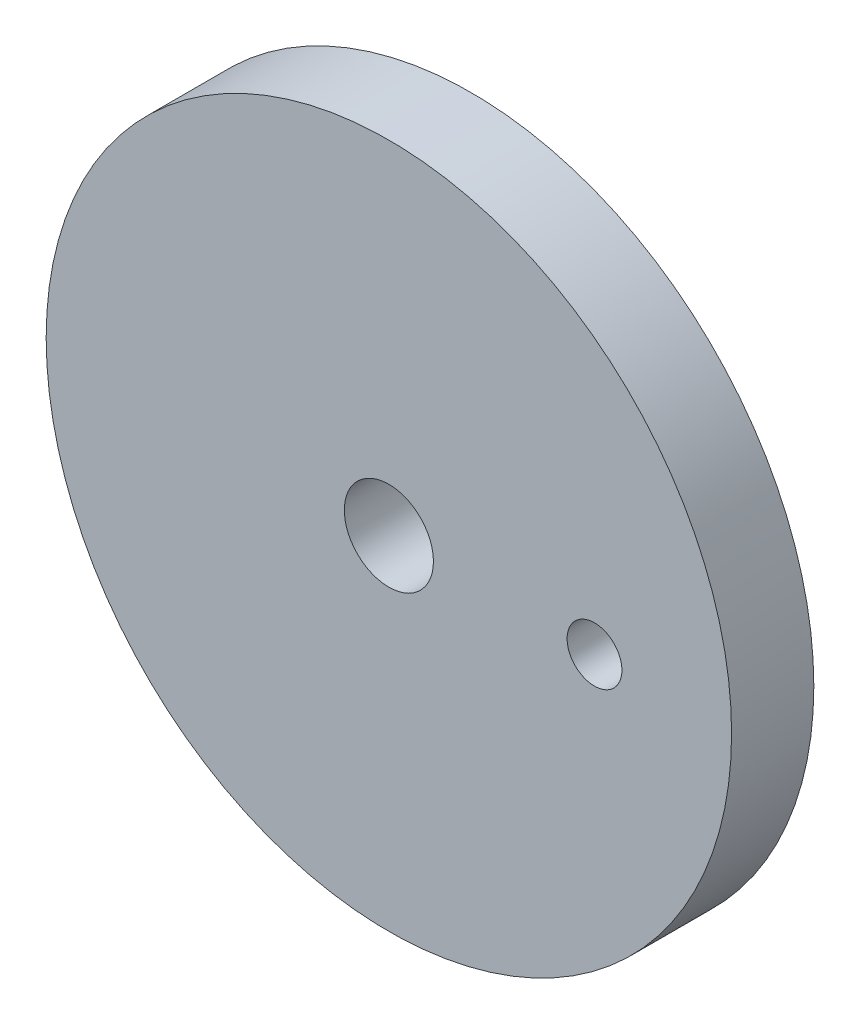
ISO-10303-21;
HEADER;
FILE_DESCRIPTION(('STEP AP214'),'2;1');
FILE_NAME('part.step','',(''),(''),'','','');
FILE_SCHEMA(('AUTOMOTIVE_DESIGN { 1 0 10303 214 1 1 1 1 }'));
ENDSEC;
DATA;
#1=APPLICATION_CONTEXT('core data for automotive mechanical design processes');
#2=APPLICATION_PROTOCOL_DEFINITION('international standard','automotive_design',2000,#1);
#3=PRODUCT_CONTEXT('',#1,'mechanical');
#4=PRODUCT('Part','Part','',(#3));
#5=PRODUCT_RELATED_PRODUCT_CATEGORY('part','',(#4));
#6=PRODUCT_DEFINITION_FORMATION('','',#4);
#7=PRODUCT_DEFINITION_CONTEXT('part definition',#1,'design');
#8=PRODUCT_DEFINITION('design','',#6,#7);
#9=PRODUCT_DEFINITION_SHAPE('','',#8);
#10=(LENGTH_UNIT() NAMED_UNIT(*) SI_UNIT(.MILLI.,.METRE.));
#11=(NAMED_UNIT(*) PLANE_ANGLE_UNIT() SI_UNIT($,.RADIAN.));
#12=(NAMED_UNIT(*) SI_UNIT($,.STERADIAN.) SOLID_ANGLE_UNIT());
#13=UNCERTAINTY_MEASURE_WITH_UNIT(LENGTH_MEASURE(1.E-05),#10,'distance_accuracy_value','');
#14=(GEOMETRIC_REPRESENTATION_CONTEXT(3) GLOBAL_UNCERTAINTY_ASSIGNED_CONTEXT((#13)) GLOBAL_UNIT_ASSIGNED_CONTEXT((#10,
#11,#12)) REPRESENTATION_CONTEXT('',''));
#15=CARTESIAN_POINT('',(0.,0.,0.));
#16=DIRECTION('',(0.,0.,1.));
#17=DIRECTION('',(1.,0.,0.));
#18=AXIS2_PLACEMENT_3D('',#15,#16,#17);
#19=CARTESIAN_POINT('',(0.,0.,3.));
#20=DIRECTION('',(0.,0.,1.));
#21=DIRECTION('',(1.,0.,0.));
#22=AXIS2_PLACEMENT_3D('',#19,#20,#21);
#23=PLANE('',#22);
#24=CARTESIAN_POINT('',(15.,0.,3.));
#25=DIRECTION('',(0.,0.,1.));
#26=DIRECTION('',(1.,0.,0.));
#27=AXIS2_PLACEMENT_3D('',#24,#25,#26);
#28=CIRCLE('',#27,2.);
#29=CARTESIAN_POINT('',(17.,0.,3.));
#30=VERTEX_POINT('',#29);
#31=EDGE_CURVE('E50',#30,#30,#28,.T.);
#32=ORIENTED_EDGE('',*,*,#31,.F.);
#33=EDGE_LOOP('',(#32));
#34=FACE_BOUND('',#33,.T.);
#35=CARTESIAN_POINT('',(0.,0.,3.));
#36=DIRECTION('',(0.,0.,1.));
#37=DIRECTION('',(1.,0.,0.));
#38=AXIS2_PLACEMENT_3D('',#35,#36,#37);
#39=CIRCLE('',#38,25.);
#40=CARTESIAN_POINT('',(25.,0.,3.));
#41=VERTEX_POINT('',#40);
#42=EDGE_CURVE('E10',#41,#41,#39,.T.);
#43=ORIENTED_EDGE('',*,*,#42,.T.);
#44=EDGE_LOOP('',(#43));
#45=FACE_BOUND('',#44,.T.);
#46=CARTESIAN_POINT('',(0.,0.,3.));
#47=DIRECTION('',(0.,0.,1.));
#48=DIRECTION('',(1.,0.,0.));
#49=AXIS2_PLACEMENT_3D('',#46,#47,#48);
#50=CIRCLE('',#49,3.25);
#51=CARTESIAN_POINT('',(3.25,0.,3.));
#52=VERTEX_POINT('',#51);
#53=EDGE_CURVE('E42',#52,#52,#50,.T.);
#54=ORIENTED_EDGE('',*,*,#53,.F.);
#55=EDGE_LOOP('',(#54));
#56=FACE_BOUND('',#55,.T.);
#57=ADVANCED_FACE('F31',(#34,#45,#56),#23,.T.);
#58=CARTESIAN_POINT('',(0.,0.,-3.));
#59=DIRECTION('',(0.,0.,1.));
#60=DIRECTION('',(1.,0.,0.));
#61=AXIS2_PLACEMENT_3D('',#58,#59,#60);
#62=PLANE('',#61);
#63=CARTESIAN_POINT('',(15.,0.,-3.));
#64=DIRECTION('',(0.,0.,1.));
#65=DIRECTION('',(1.,0.,0.));
#66=AXIS2_PLACEMENT_3D('',#63,#64,#65);
#67=CIRCLE('',#66,2.);
#68=CARTESIAN_POINT('',(17.,0.,-3.));
#69=VERTEX_POINT('',#68);
#70=EDGE_CURVE('E47',#69,#69,#67,.T.);
#71=ORIENTED_EDGE('',*,*,#70,.T.);
#72=EDGE_LOOP('',(#71));
#73=FACE_BOUND('',#72,.T.);
#74=CARTESIAN_POINT('',(0.,0.,-3.));
#75=DIRECTION('',(0.,0.,1.));
#76=DIRECTION('',(1.,0.,0.));
#77=AXIS2_PLACEMENT_3D('',#74,#75,#76);
#78=CIRCLE('',#77,25.);
#79=CARTESIAN_POINT('',(25.,0.,-3.));
#80=VERTEX_POINT('',#79);
#81=EDGE_CURVE('E35',#80,#80,#78,.T.);
#82=ORIENTED_EDGE('',*,*,#81,.F.);
#83=EDGE_LOOP('',(#82));
#84=FACE_BOUND('',#83,.T.);
#85=CARTESIAN_POINT('',(0.,0.,-3.));
#86=DIRECTION('',(0.,0.,1.));
#87=DIRECTION('',(1.,0.,0.));
#88=AXIS2_PLACEMENT_3D('',#85,#86,#87);
#89=CIRCLE('',#88,3.25);
#90=CARTESIAN_POINT('',(3.25,0.,-3.));
#91=VERTEX_POINT('',#90);
#92=EDGE_CURVE('E44',#91,#91,#89,.T.);
#93=ORIENTED_EDGE('',*,*,#92,.T.);
#94=EDGE_LOOP('',(#93));
#95=FACE_BOUND('',#94,.T.);
#96=ADVANCED_FACE('F56',(#73,#84,#95),#62,.F.);
#97=CARTESIAN_POINT('',(0.,0.,3.));
#98=DIRECTION('',(0.,0.,-1.));
#99=DIRECTION('',(-1.,0.,0.));
#100=AXIS2_PLACEMENT_3D('',#97,#98,#99);
#101=CYLINDRICAL_SURFACE('',#100,25.);
#102=ORIENTED_EDGE('',*,*,#42,.F.);
#103=EDGE_LOOP('',(#102));
#104=FACE_BOUND('',#103,.T.);
#105=ORIENTED_EDGE('',*,*,#81,.T.);
#106=EDGE_LOOP('',(#105));
#107=FACE_BOUND('',#106,.T.);
#108=ADVANCED_FACE('F33',(#104,#107),#101,.T.);
#109=CARTESIAN_POINT('',(0.,0.,3.));
#110=DIRECTION('',(0.,0.,-1.));
#111=DIRECTION('',(-1.,0.,0.));
#112=AXIS2_PLACEMENT_3D('',#109,#110,#111);
#113=CYLINDRICAL_SURFACE('',#112,3.25);
#114=ORIENTED_EDGE('',*,*,#53,.T.);
#115=EDGE_LOOP('',(#114));
#116=FACE_BOUND('',#115,.T.);
#117=ORIENTED_EDGE('',*,*,#92,.F.);
#118=EDGE_LOOP('',(#117));
#119=FACE_BOUND('',#118,.T.);
#120=ADVANCED_FACE('F62',(#116,#119),#113,.F.);
#121=CARTESIAN_POINT('',(15.,0.,-3.));
#122=DIRECTION('',(0.,0.,1.));
#123=DIRECTION('',(1.,0.,0.));
#124=AXIS2_PLACEMENT_3D('',#121,#122,#123);
#125=CYLINDRICAL_SURFACE('',#124,2.);
#126=ORIENTED_EDGE('',*,*,#70,.F.);
#127=EDGE_LOOP('',(#126));
#128=FACE_BOUND('',#127,.T.);
#129=ORIENTED_EDGE('',*,*,#31,.T.);
#130=EDGE_LOOP('',(#129));
#131=FACE_BOUND('',#130,.T.);
#132=ADVANCED_FACE('F59',(#128,#131),#125,.F.);
#133=CLOSED_SHELL('',(#57,#96,#108,#120,#132));
#134=MANIFOLD_SOLID_BREP('B2',#133);
#135=ADVANCED_BREP_SHAPE_REPRESENTATION('',(#18,#134),#14);
#136=SHAPE_DEFINITION_REPRESENTATION(#9,#135);
ENDSEC;
END-ISO-10303-21;
